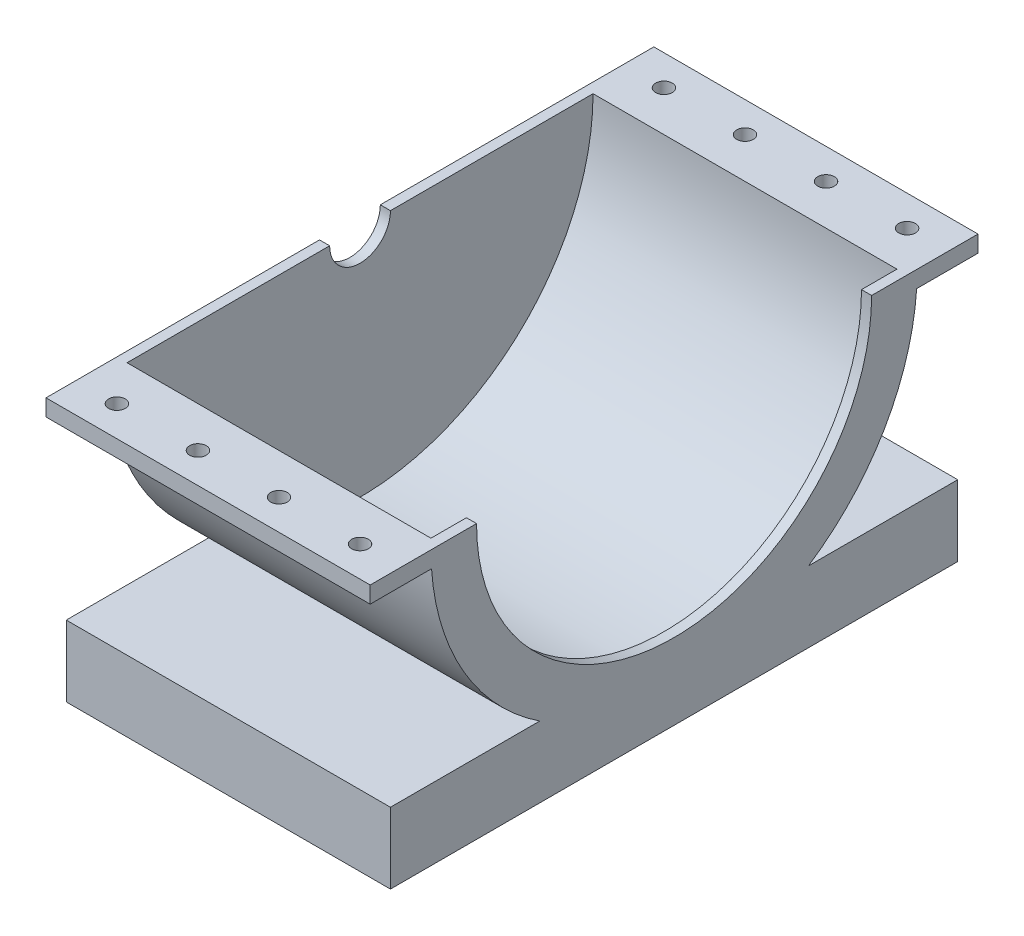
ISO-10303-21;
HEADER;
FILE_DESCRIPTION(('STEP AP214'),'2;1');
FILE_NAME('part.step','',(''),(''),'','','');
FILE_SCHEMA(('AUTOMOTIVE_DESIGN { 1 0 10303 214 1 1 1 1 }'));
ENDSEC;
DATA;
#1=APPLICATION_CONTEXT('core data for automotive mechanical design processes');
#2=APPLICATION_PROTOCOL_DEFINITION('international standard','automotive_design',2000,#1);
#3=PRODUCT_CONTEXT('',#1,'mechanical');
#4=PRODUCT('Part','Part','',(#3));
#5=PRODUCT_RELATED_PRODUCT_CATEGORY('part','',(#4));
#6=PRODUCT_DEFINITION_FORMATION('','',#4);
#7=PRODUCT_DEFINITION_CONTEXT('part definition',#1,'design');
#8=PRODUCT_DEFINITION('design','',#6,#7);
#9=PRODUCT_DEFINITION_SHAPE('','',#8);
#10=(LENGTH_UNIT() NAMED_UNIT(*) SI_UNIT(.MILLI.,.METRE.));
#11=(NAMED_UNIT(*) PLANE_ANGLE_UNIT() SI_UNIT($,.RADIAN.));
#12=(NAMED_UNIT(*) SI_UNIT($,.STERADIAN.) SOLID_ANGLE_UNIT());
#13=UNCERTAINTY_MEASURE_WITH_UNIT(LENGTH_MEASURE(1.E-05),#10,'distance_accuracy_value','');
#14=(GEOMETRIC_REPRESENTATION_CONTEXT(3) GLOBAL_UNCERTAINTY_ASSIGNED_CONTEXT((#13)) GLOBAL_UNIT_ASSIGNED_CONTEXT((#10,
#11,#12)) REPRESENTATION_CONTEXT('',''));
#15=CARTESIAN_POINT('',(0.,0.,0.));
#16=DIRECTION('',(0.,0.,1.));
#17=DIRECTION('',(1.,0.,0.));
#18=AXIS2_PLACEMENT_3D('',#15,#16,#17);
#19=CARTESIAN_POINT('',(105.467633956977,130.851537973943,190.5));
#20=DIRECTION('',(0.,1.,0.));
#21=DIRECTION('',(0.,0.,1.));
#22=AXIS2_PLACEMENT_3D('',#19,#20,#21);
#23=PLANE('',#22);
#24=DIRECTION('',(1.,0.,0.));
#25=VECTOR('',#24,1.);
#26=CARTESIAN_POINT('',(-97.757766043023,130.851537973943,123.825));
#27=LINE('',#26,#25);
#28=CARTESIAN_POINT('',(105.467633956977,130.851537973943,123.825));
#29=VERTEX_POINT('',#28);
#30=CARTESIAN_POINT('',(99.117633956977,130.851537973943,123.825));
#31=VERTEX_POINT('',#30);
#32=EDGE_CURVE('E200',#29,#31,#27,.F.);
#33=ORIENTED_EDGE('',*,*,#32,.T.);
#34=DIRECTION('',(0.,0.,-1.));
#35=VECTOR('',#34,1.);
#36=CARTESIAN_POINT('',(99.117633956977,130.851537973943,190.5));
#37=LINE('',#36,#35);
#38=CARTESIAN_POINT('',(99.117633956977,130.851537973943,146.05));
#39=VERTEX_POINT('',#38);
#40=EDGE_CURVE('E211',#39,#31,#37,.T.);
#41=ORIENTED_EDGE('',*,*,#40,.F.);
#42=DIRECTION('',(1.,0.,0.));
#43=VECTOR('',#42,1.);
#44=CARTESIAN_POINT('',(-91.3823660430229,130.851537973943,146.05));
#45=LINE('',#44,#43);
#46=CARTESIAN_POINT('',(-91.3823660430229,130.851537973943,146.05));
#47=VERTEX_POINT('',#46);
#48=EDGE_CURVE('E224',#47,#39,#45,.T.);
#49=ORIENTED_EDGE('',*,*,#48,.F.);
#50=DIRECTION('',(0.,0.,-1.));
#51=VECTOR('',#50,1.);
#52=CARTESIAN_POINT('',(-91.3823660430229,130.851537973943,190.5));
#53=LINE('',#52,#51);
#54=CARTESIAN_POINT('',(-91.3823660430229,130.851537973943,19.0500000000001));
#55=VERTEX_POINT('',#54);
#56=EDGE_CURVE('E12',#47,#55,#53,.T.);
#57=ORIENTED_EDGE('',*,*,#56,.T.);
#58=DIRECTION('',(1.,0.,0.));
#59=VECTOR('',#58,1.);
#60=CARTESIAN_POINT('',(-97.7323660430229,130.851537973943,19.0500000000001));
#61=LINE('',#60,#59);
#62=CARTESIAN_POINT('',(-97.7323660430229,130.851537973943,19.0500000000001));
#63=VERTEX_POINT('',#62);
#64=EDGE_CURVE('E98',#63,#55,#61,.T.);
#65=ORIENTED_EDGE('',*,*,#64,.F.);
#66=DIRECTION('',(0.,0.,-1.));
#67=VECTOR('',#66,1.);
#68=CARTESIAN_POINT('',(-97.7323660430229,130.851537973943,190.5));
#69=LINE('',#68,#67);
#70=CARTESIAN_POINT('',(-97.7323660430229,130.851537973943,190.5));
#71=VERTEX_POINT('',#70);
#72=EDGE_CURVE('E306',#71,#63,#69,.T.);
#73=ORIENTED_EDGE('',*,*,#72,.F.);
#74=DIRECTION('',(-1.,0.,0.));
#75=VECTOR('',#74,1.);
#76=CARTESIAN_POINT('',(105.467633956977,130.851537973943,190.5));
#77=LINE('',#76,#75);
#78=CARTESIAN_POINT('',(105.467633956977,130.851537973943,190.5));
#79=VERTEX_POINT('',#78);
#80=EDGE_CURVE('E314',#79,#71,#77,.T.);
#81=ORIENTED_EDGE('',*,*,#80,.F.);
#82=DIRECTION('',(0.,0.,-1.));
#83=VECTOR('',#82,1.);
#84=CARTESIAN_POINT('',(105.467633956977,130.851537973943,190.5));
#85=LINE('',#84,#83);
#86=EDGE_CURVE('E213',#79,#29,#85,.T.);
#87=ORIENTED_EDGE('',*,*,#86,.T.);
#88=EDGE_LOOP('',(#33,#41,#49,#57,#65,#73,#81,#87));
#89=FACE_BOUND('',#88,.T.);
#90=CARTESIAN_POINT('',(-72.332366043023,130.851537973943,171.45));
#91=DIRECTION('',(0.,1.,0.));
#92=DIRECTION('',(0.,0.,1.));
#93=AXIS2_PLACEMENT_3D('',#90,#91,#92);
#94=CIRCLE('',#93,5.20699999999999);
#95=CARTESIAN_POINT('',(-72.332366043023,130.851537973943,176.657));
#96=VERTEX_POINT('',#95);
#97=EDGE_CURVE('E370',#96,#96,#94,.T.);
#98=ORIENTED_EDGE('',*,*,#97,.F.);
#99=EDGE_LOOP('',(#98));
#100=FACE_BOUND('',#99,.T.);
#101=CARTESIAN_POINT('',(-21.532366043023,130.851537973943,171.45));
#102=DIRECTION('',(0.,1.,0.));
#103=DIRECTION('',(0.,0.,1.));
#104=AXIS2_PLACEMENT_3D('',#101,#102,#103);
#105=CIRCLE('',#104,5.20699999999999);
#106=CARTESIAN_POINT('',(-21.532366043023,130.851537973943,176.657));
#107=VERTEX_POINT('',#106);
#108=EDGE_CURVE('E364',#107,#107,#105,.T.);
#109=ORIENTED_EDGE('',*,*,#108,.F.);
#110=EDGE_LOOP('',(#109));
#111=FACE_BOUND('',#110,.T.);
#112=CARTESIAN_POINT('',(29.267633956977,130.851537973943,171.45));
#113=DIRECTION('',(0.,1.,0.));
#114=DIRECTION('',(0.,0.,1.));
#115=AXIS2_PLACEMENT_3D('',#112,#113,#114);
#116=CIRCLE('',#115,5.20699999999999);
#117=CARTESIAN_POINT('',(29.267633956977,130.851537973943,176.657));
#118=VERTEX_POINT('',#117);
#119=EDGE_CURVE('E358',#118,#118,#116,.T.);
#120=ORIENTED_EDGE('',*,*,#119,.F.);
#121=EDGE_LOOP('',(#120));
#122=FACE_BOUND('',#121,.T.);
#123=CARTESIAN_POINT('',(80.067633956977,130.851537973943,171.45));
#124=DIRECTION('',(0.,1.,0.));
#125=DIRECTION('',(0.,0.,1.));
#126=AXIS2_PLACEMENT_3D('',#123,#124,#125);
#127=CIRCLE('',#126,5.20699999999999);
#128=CARTESIAN_POINT('',(80.067633956977,130.851537973943,176.657));
#129=VERTEX_POINT('',#128);
#130=EDGE_CURVE('E352',#129,#129,#127,.T.);
#131=ORIENTED_EDGE('',*,*,#130,.F.);
#132=EDGE_LOOP('',(#131));
#133=FACE_BOUND('',#132,.T.);
#134=ADVANCED_FACE('F75',(#89,#100,#111,#122,#133),#23,.T.);
#135=DIRECTION('',(1.,0.,0.));
#136=VECTOR('',#135,1.);
#137=CARTESIAN_POINT('',(-97.757766043023,130.851537973943,-123.825));
#138=LINE('',#137,#136);
#139=CARTESIAN_POINT('',(99.117633956977,130.851537973943,-123.825));
#140=VERTEX_POINT('',#139);
#141=CARTESIAN_POINT('',(105.467633956977,130.851537973943,-123.825));
#142=VERTEX_POINT('',#141);
#143=EDGE_CURVE('E90',#140,#142,#138,.T.);
#144=ORIENTED_EDGE('',*,*,#143,.T.);
#145=CARTESIAN_POINT('',(105.467633956977,130.851537973943,-190.5));
#146=VERTEX_POINT('',#145);
#147=EDGE_CURVE('E313',#142,#146,#85,.T.);
#148=ORIENTED_EDGE('',*,*,#147,.T.);
#149=DIRECTION('',(-1.,0.,0.));
#150=VECTOR('',#149,1.);
#151=CARTESIAN_POINT('',(105.467633956977,130.851537973943,-190.5));
#152=LINE('',#151,#150);
#153=CARTESIAN_POINT('',(-97.7323660430229,130.851537973943,-190.5));
#154=VERTEX_POINT('',#153);
#155=EDGE_CURVE('E326',#146,#154,#152,.T.);
#156=ORIENTED_EDGE('',*,*,#155,.T.);
#157=CARTESIAN_POINT('',(-97.7323660430229,130.851537973943,-19.0499999999999));
#158=VERTEX_POINT('',#157);
#159=EDGE_CURVE('E322',#158,#154,#69,.T.);
#160=ORIENTED_EDGE('',*,*,#159,.F.);
#161=DIRECTION('',(1.,0.,0.));
#162=VECTOR('',#161,1.);
#163=CARTESIAN_POINT('',(-97.7323660430229,130.851537973943,-19.0499999999999));
#164=LINE('',#163,#162);
#165=CARTESIAN_POINT('',(-91.3823660430229,130.851537973943,-19.0499999999999));
#166=VERTEX_POINT('',#165);
#167=EDGE_CURVE('E239',#158,#166,#164,.T.);
#168=ORIENTED_EDGE('',*,*,#167,.T.);
#169=CARTESIAN_POINT('',(-91.3823660430229,130.851537973943,-146.05));
#170=VERTEX_POINT('',#169);
#171=EDGE_CURVE('E83',#166,#170,#53,.T.);
#172=ORIENTED_EDGE('',*,*,#171,.T.);
#173=DIRECTION('',(1.,0.,0.));
#174=VECTOR('',#173,1.);
#175=CARTESIAN_POINT('',(-91.3823660430229,130.851537973943,-146.05));
#176=LINE('',#175,#174);
#177=CARTESIAN_POINT('',(99.117633956977,130.851537973943,-146.05));
#178=VERTEX_POINT('',#177);
#179=EDGE_CURVE('E220',#178,#170,#176,.F.);
#180=ORIENTED_EDGE('',*,*,#179,.F.);
#181=EDGE_CURVE('E221',#140,#178,#37,.T.);
#182=ORIENTED_EDGE('',*,*,#181,.F.);
#183=EDGE_LOOP('',(#144,#148,#156,#160,#168,#172,#180,#182));
#184=FACE_BOUND('',#183,.T.);
#185=CARTESIAN_POINT('',(80.067633956977,130.851537973943,-171.45));
#186=DIRECTION('',(0.,1.,0.));
#187=DIRECTION('',(0.,0.,1.));
#188=AXIS2_PLACEMENT_3D('',#185,#186,#187);
#189=CIRCLE('',#188,5.20699999999999);
#190=CARTESIAN_POINT('',(80.067633956977,130.851537973943,-166.243));
#191=VERTEX_POINT('',#190);
#192=EDGE_CURVE('E376',#191,#191,#189,.T.);
#193=ORIENTED_EDGE('',*,*,#192,.F.);
#194=EDGE_LOOP('',(#193));
#195=FACE_BOUND('',#194,.T.);
#196=CARTESIAN_POINT('',(29.267633956977,130.851537973943,-171.45));
#197=DIRECTION('',(0.,1.,0.));
#198=DIRECTION('',(0.,0.,1.));
#199=AXIS2_PLACEMENT_3D('',#196,#197,#198);
#200=CIRCLE('',#199,5.20699999999999);
#201=CARTESIAN_POINT('',(29.267633956977,130.851537973943,-166.243));
#202=VERTEX_POINT('',#201);
#203=EDGE_CURVE('E382',#202,#202,#200,.T.);
#204=ORIENTED_EDGE('',*,*,#203,.F.);
#205=EDGE_LOOP('',(#204));
#206=FACE_BOUND('',#205,.T.);
#207=CARTESIAN_POINT('',(-21.532366043023,130.851537973943,-171.45));
#208=DIRECTION('',(0.,1.,0.));
#209=DIRECTION('',(0.,0.,1.));
#210=AXIS2_PLACEMENT_3D('',#207,#208,#209);
#211=CIRCLE('',#210,5.20699999999999);
#212=CARTESIAN_POINT('',(-21.532366043023,130.851537973943,-166.243));
#213=VERTEX_POINT('',#212);
#214=EDGE_CURVE('E388',#213,#213,#211,.T.);
#215=ORIENTED_EDGE('',*,*,#214,.F.);
#216=EDGE_LOOP('',(#215));
#217=FACE_BOUND('',#216,.T.);
#218=CARTESIAN_POINT('',(-72.332366043023,130.851537973943,-171.45));
#219=DIRECTION('',(0.,1.,0.));
#220=DIRECTION('',(0.,0.,1.));
#221=AXIS2_PLACEMENT_3D('',#218,#219,#220);
#222=CIRCLE('',#221,5.20699999999999);
#223=CARTESIAN_POINT('',(-72.332366043023,130.851537973943,-166.243));
#224=VERTEX_POINT('',#223);
#225=EDGE_CURVE('E250',#224,#224,#222,.T.);
#226=ORIENTED_EDGE('',*,*,#225,.F.);
#227=EDGE_LOOP('',(#226));
#228=FACE_BOUND('',#227,.T.);
#229=ADVANCED_FACE('F236',(#184,#195,#206,#217,#228),#23,.T.);
#230=CARTESIAN_POINT('',(105.467633956977,3.85153797394263,0.));
#231=DIRECTION('',(0.,1.,0.));
#232=DIRECTION('',(0.,0.,1.));
#233=AXIS2_PLACEMENT_3D('',#230,#231,#232);
#234=PLANE('',#233);
#235=DIRECTION('',(0.,0.,-1.));
#236=VECTOR('',#235,1.);
#237=CARTESIAN_POINT('',(-97.7323660430229,3.85153797394263,0.));
#238=LINE('',#237,#236);
#239=CARTESIAN_POINT('',(-97.7323660430229,3.85153797394263,-84.2422696750271));
#240=VERTEX_POINT('',#239);
#241=CARTESIAN_POINT('',(-97.7323660430229,3.85153797394263,-177.8));
#242=VERTEX_POINT('',#241);
#243=EDGE_CURVE('E272',#240,#242,#238,.T.);
#244=ORIENTED_EDGE('',*,*,#243,.F.);
#245=DIRECTION('',(-1.,0.,0.));
#246=VECTOR('',#245,1.);
#247=CARTESIAN_POINT('',(105.467633956977,3.85153797394263,-84.2422696750271));
#248=LINE('',#247,#246);
#249=CARTESIAN_POINT('',(105.467633956977,3.85153797394263,-84.2422696750271));
#250=VERTEX_POINT('',#249);
#251=EDGE_CURVE('E226',#250,#240,#248,.T.);
#252=ORIENTED_EDGE('',*,*,#251,.F.);
#253=DIRECTION('',(0.,0.,-1.));
#254=VECTOR('',#253,1.);
#255=CARTESIAN_POINT('',(105.467633956977,3.85153797394263,0.));
#256=LINE('',#255,#254);
#257=CARTESIAN_POINT('',(105.467633956977,3.85153797394263,-177.8));
#258=VERTEX_POINT('',#257);
#259=EDGE_CURVE('E255',#250,#258,#256,.T.);
#260=ORIENTED_EDGE('',*,*,#259,.T.);
#261=DIRECTION('',(-1.,0.,0.));
#262=VECTOR('',#261,1.);
#263=CARTESIAN_POINT('',(105.467633956977,3.85153797394263,-177.8));
#264=LINE('',#263,#262);
#265=EDGE_CURVE('E271',#258,#242,#264,.T.);
#266=ORIENTED_EDGE('',*,*,#265,.T.);
#267=EDGE_LOOP('',(#244,#252,#260,#266));
#268=FACE_BOUND('',#267,.T.);
#269=ADVANCED_FACE('F403',(#268),#234,.T.);
#270=CARTESIAN_POINT('',(105.467633956977,130.851537973943,0.));
#271=DIRECTION('',(-1.,0.,0.));
#272=DIRECTION('',(0.,0.,1.));
#273=AXIS2_PLACEMENT_3D('',#270,#271,#272);
#274=CYLINDRICAL_SURFACE('',#273,152.4);
#275=CARTESIAN_POINT('',(-97.7323660430229,130.851537973943,0.));
#276=DIRECTION('',(1.,0.,0.));
#277=DIRECTION('',(0.,0.,-1.));
#278=AXIS2_PLACEMENT_3D('',#275,#276,#277);
#279=CIRCLE('',#278,152.4);
#280=CARTESIAN_POINT('',(-97.7323660430229,120.437537973943,-152.043772000039));
#281=VERTEX_POINT('',#280);
#282=EDGE_CURVE('E275',#281,#240,#279,.F.);
#283=ORIENTED_EDGE('',*,*,#282,.F.);
#284=DIRECTION('',(-1.,0.,0.));
#285=VECTOR('',#284,1.);
#286=CARTESIAN_POINT('',(105.467633956977,120.437537973943,-152.043772000039));
#287=LINE('',#286,#285);
#288=CARTESIAN_POINT('',(105.467633956977,120.437537973943,-152.043772000039));
#289=VERTEX_POINT('',#288);
#290=EDGE_CURVE('E299',#289,#281,#287,.T.);
#291=ORIENTED_EDGE('',*,*,#290,.F.);
#292=CARTESIAN_POINT('',(105.467633956977,130.851537973943,0.));
#293=DIRECTION('',(1.,0.,0.));
#294=DIRECTION('',(0.,0.,-1.));
#295=AXIS2_PLACEMENT_3D('',#292,#293,#294);
#296=CIRCLE('',#295,152.4);
#297=EDGE_CURVE('E258',#289,#250,#296,.F.);
#298=ORIENTED_EDGE('',*,*,#297,.T.);
#299=ORIENTED_EDGE('',*,*,#251,.T.);
#300=EDGE_LOOP('',(#283,#291,#298,#299));
#301=FACE_BOUND('',#300,.T.);
#302=ADVANCED_FACE('F410',(#301),#274,.T.);
#303=CARTESIAN_POINT('',(-97.7323660430229,3.85153797394263,84.2422696750272));
#304=VERTEX_POINT('',#303);
#305=CARTESIAN_POINT('',(-97.7323660430229,120.437537973943,152.04377200004));
#306=VERTEX_POINT('',#305);
#307=EDGE_CURVE('E279',#304,#306,#279,.F.);
#308=ORIENTED_EDGE('',*,*,#307,.F.);
#309=DIRECTION('',(-1.,0.,0.));
#310=VECTOR('',#309,1.);
#311=CARTESIAN_POINT('',(105.467633956977,3.85153797394263,84.2422696750272));
#312=LINE('',#311,#310);
#313=CARTESIAN_POINT('',(105.467633956977,3.85153797394263,84.2422696750272));
#314=VERTEX_POINT('',#313);
#315=EDGE_CURVE('E295',#314,#304,#312,.T.);
#316=ORIENTED_EDGE('',*,*,#315,.F.);
#317=CARTESIAN_POINT('',(105.467633956977,120.437537973943,152.04377200004));
#318=VERTEX_POINT('',#317);
#319=EDGE_CURVE('E263',#314,#318,#296,.F.);
#320=ORIENTED_EDGE('',*,*,#319,.T.);
#321=DIRECTION('',(-1.,0.,0.));
#322=VECTOR('',#321,1.);
#323=CARTESIAN_POINT('',(105.467633956977,120.437537973943,152.04377200004));
#324=LINE('',#323,#322);
#325=EDGE_CURVE('E297',#318,#306,#324,.T.);
#326=ORIENTED_EDGE('',*,*,#325,.T.);
#327=EDGE_LOOP('',(#308,#316,#320,#326));
#328=FACE_BOUND('',#327,.T.);
#329=ADVANCED_FACE('F611',(#328),#274,.T.);
#330=CARTESIAN_POINT('',(-97.7323660430229,3.85153797394263,177.8));
#331=VERTEX_POINT('',#330);
#332=EDGE_CURVE('E276',#331,#304,#238,.T.);
#333=ORIENTED_EDGE('',*,*,#332,.F.);
#334=DIRECTION('',(-1.,0.,0.));
#335=VECTOR('',#334,1.);
#336=CARTESIAN_POINT('',(105.467633956977,3.85153797394263,177.8));
#337=LINE('',#336,#335);
#338=CARTESIAN_POINT('',(105.467633956977,3.85153797394263,177.8));
#339=VERTEX_POINT('',#338);
#340=EDGE_CURVE('E293',#339,#331,#337,.T.);
#341=ORIENTED_EDGE('',*,*,#340,.F.);
#342=EDGE_CURVE('E260',#339,#314,#256,.T.);
#343=ORIENTED_EDGE('',*,*,#342,.T.);
#344=ORIENTED_EDGE('',*,*,#315,.T.);
#345=EDGE_LOOP('',(#333,#341,#343,#344));
#346=FACE_BOUND('',#345,.T.);
#347=ADVANCED_FACE('F413',(#346),#234,.T.);
#348=CARTESIAN_POINT('',(105.467633956977,-18.3734620260574,177.8));
#349=DIRECTION('',(0.,0.,1.));
#350=DIRECTION('',(1.,0.,0.));
#351=AXIS2_PLACEMENT_3D('',#348,#349,#350);
#352=PLANE('',#351);
#353=DIRECTION('',(0.,1.,0.));
#354=VECTOR('',#353,1.);
#355=CARTESIAN_POINT('',(-97.7323660430229,-18.3734620260574,177.8));
#356=LINE('',#355,#354);
#357=CARTESIAN_POINT('',(-97.7323660430229,-40.5984620260574,177.8));
#358=VERTEX_POINT('',#357);
#359=EDGE_CURVE('E280',#358,#331,#356,.T.);
#360=ORIENTED_EDGE('',*,*,#359,.F.);
#361=DIRECTION('',(-1.,0.,0.));
#362=VECTOR('',#361,1.);
#363=CARTESIAN_POINT('',(105.467633956977,-40.5984620260574,177.8));
#364=LINE('',#363,#362);
#365=CARTESIAN_POINT('',(105.467633956977,-40.5984620260574,177.8));
#366=VERTEX_POINT('',#365);
#367=EDGE_CURVE('E291',#366,#358,#364,.T.);
#368=ORIENTED_EDGE('',*,*,#367,.F.);
#369=DIRECTION('',(0.,1.,0.));
#370=VECTOR('',#369,1.);
#371=CARTESIAN_POINT('',(105.467633956977,-18.3734620260574,177.8));
#372=LINE('',#371,#370);
#373=EDGE_CURVE('E264',#366,#339,#372,.T.);
#374=ORIENTED_EDGE('',*,*,#373,.T.);
#375=ORIENTED_EDGE('',*,*,#340,.T.);
#376=EDGE_LOOP('',(#360,#368,#374,#375));
#377=FACE_BOUND('',#376,.T.);
#378=ADVANCED_FACE('F590',(#377),#352,.T.);
#379=CARTESIAN_POINT('',(105.467633956977,-40.5984620260574,0.));
#380=DIRECTION('',(0.,1.,0.));
#381=DIRECTION('',(0.,0.,1.));
#382=AXIS2_PLACEMENT_3D('',#379,#380,#381);
#383=PLANE('',#382);
#384=DIRECTION('',(0.,0.,-1.));
#385=VECTOR('',#384,1.);
#386=CARTESIAN_POINT('',(-97.7323660430229,-40.5984620260574,0.));
#387=LINE('',#386,#385);
#388=CARTESIAN_POINT('',(-97.7323660430229,-40.5984620260574,-177.8));
#389=VERTEX_POINT('',#388);
#390=EDGE_CURVE('E283',#358,#389,#387,.T.);
#391=ORIENTED_EDGE('',*,*,#390,.T.);
#392=DIRECTION('',(-1.,0.,0.));
#393=VECTOR('',#392,1.);
#394=CARTESIAN_POINT('',(105.467633956977,-40.5984620260574,-177.8));
#395=LINE('',#394,#393);
#396=CARTESIAN_POINT('',(105.467633956977,-40.5984620260574,-177.8));
#397=VERTEX_POINT('',#396);
#398=EDGE_CURVE('E288',#397,#389,#395,.T.);
#399=ORIENTED_EDGE('',*,*,#398,.F.);
#400=DIRECTION('',(0.,0.,-1.));
#401=VECTOR('',#400,1.);
#402=CARTESIAN_POINT('',(105.467633956977,-40.5984620260574,0.));
#403=LINE('',#402,#401);
#404=EDGE_CURVE('E267',#366,#397,#403,.T.);
#405=ORIENTED_EDGE('',*,*,#404,.F.);
#406=ORIENTED_EDGE('',*,*,#367,.T.);
#407=EDGE_LOOP('',(#391,#399,#405,#406));
#408=FACE_BOUND('',#407,.T.);
#409=ADVANCED_FACE('F580',(#408),#383,.F.);
#410=CARTESIAN_POINT('',(105.467633956977,-18.3734620260574,-177.8));
#411=DIRECTION('',(0.,0.,1.));
#412=DIRECTION('',(1.,0.,0.));
#413=AXIS2_PLACEMENT_3D('',#410,#411,#412);
#414=PLANE('',#413);
#415=DIRECTION('',(0.,1.,0.));
#416=VECTOR('',#415,1.);
#417=CARTESIAN_POINT('',(-97.7323660430229,-18.3734620260574,-177.8));
#418=LINE('',#417,#416);
#419=EDGE_CURVE('E259',#389,#242,#418,.T.);
#420=ORIENTED_EDGE('',*,*,#419,.T.);
#421=ORIENTED_EDGE('',*,*,#265,.F.);
#422=DIRECTION('',(0.,1.,0.));
#423=VECTOR('',#422,1.);
#424=CARTESIAN_POINT('',(105.467633956977,-18.3734620260574,-177.8));
#425=LINE('',#424,#423);
#426=EDGE_CURVE('E269',#397,#258,#425,.T.);
#427=ORIENTED_EDGE('',*,*,#426,.F.);
#428=ORIENTED_EDGE('',*,*,#398,.T.);
#429=EDGE_LOOP('',(#420,#421,#427,#428));
#430=FACE_BOUND('',#429,.T.);
#431=ADVANCED_FACE('F435',(#430),#414,.F.);
#432=CARTESIAN_POINT('',(105.467633956977,-18.3734620260574,0.));
#433=DIRECTION('',(1.,0.,0.));
#434=DIRECTION('',(0.,0.,-1.));
#435=AXIS2_PLACEMENT_3D('',#432,#433,#434);
#436=PLANE('',#435);
#437=CARTESIAN_POINT('',(105.467633956977,130.851537973943,0.));
#438=DIRECTION('',(1.,0.,0.));
#439=DIRECTION('',(0.,0.,-1.));
#440=AXIS2_PLACEMENT_3D('',#437,#438,#439);
#441=CIRCLE('',#440,123.825);
#442=EDGE_CURVE('E214',#29,#142,#441,.T.);
#443=ORIENTED_EDGE('',*,*,#442,.F.);
#444=ORIENTED_EDGE('',*,*,#86,.F.);
#445=DIRECTION('',(0.,-1.,0.));
#446=VECTOR('',#445,1.);
#447=CARTESIAN_POINT('',(105.467633956977,130.851537973943,190.5));
#448=LINE('',#447,#446);
#449=CARTESIAN_POINT('',(105.467633956977,120.437537973943,190.5));
#450=VERTEX_POINT('',#449);
#451=EDGE_CURVE('E302',#79,#450,#448,.T.);
#452=ORIENTED_EDGE('',*,*,#451,.T.);
#453=DIRECTION('',(0.,0.,-1.));
#454=VECTOR('',#453,1.);
#455=CARTESIAN_POINT('',(105.467633956977,120.437537973943,190.5));
#456=LINE('',#455,#454);
#457=EDGE_CURVE('E307',#450,#318,#456,.T.);
#458=ORIENTED_EDGE('',*,*,#457,.T.);
#459=ORIENTED_EDGE('',*,*,#319,.F.);
#460=ORIENTED_EDGE('',*,*,#342,.F.);
#461=ORIENTED_EDGE('',*,*,#373,.F.);
#462=ORIENTED_EDGE('',*,*,#404,.T.);
#463=ORIENTED_EDGE('',*,*,#426,.T.);
#464=ORIENTED_EDGE('',*,*,#259,.F.);
#465=ORIENTED_EDGE('',*,*,#297,.F.);
#466=CARTESIAN_POINT('',(105.467633956977,120.437537973943,-190.5));
#467=VERTEX_POINT('',#466);
#468=EDGE_CURVE('E305',#289,#467,#456,.T.);
#469=ORIENTED_EDGE('',*,*,#468,.T.);
#470=DIRECTION('',(0.,-1.,0.));
#471=VECTOR('',#470,1.);
#472=CARTESIAN_POINT('',(105.467633956977,130.851537973943,-190.5));
#473=LINE('',#472,#471);
#474=EDGE_CURVE('E310',#146,#467,#473,.T.);
#475=ORIENTED_EDGE('',*,*,#474,.F.);
#476=ORIENTED_EDGE('',*,*,#147,.F.);
#477=EDGE_LOOP('',(#443,#444,#452,#458,#459,#460,#461,#462,#463,#464,#465,#469,#475,#476));
#478=FACE_BOUND('',#477,.T.);
#479=ADVANCED_FACE('F430',(#478),#436,.T.);
#480=CARTESIAN_POINT('',(-97.7323660430229,-18.3734620260574,0.));
#481=DIRECTION('',(1.,0.,0.));
#482=DIRECTION('',(0.,0.,-1.));
#483=AXIS2_PLACEMENT_3D('',#480,#481,#482);
#484=PLANE('',#483);
#485=ORIENTED_EDGE('',*,*,#72,.T.);
#486=CARTESIAN_POINT('',(-97.7323660430229,130.851537973943,0.));
#487=DIRECTION('',(1.,0.,0.));
#488=DIRECTION('',(0.,0.,-1.));
#489=AXIS2_PLACEMENT_3D('',#486,#487,#488);
#490=CIRCLE('',#489,19.05);
#491=EDGE_CURVE('E345',#63,#158,#490,.T.);
#492=ORIENTED_EDGE('',*,*,#491,.T.);
#493=ORIENTED_EDGE('',*,*,#159,.T.);
#494=DIRECTION('',(0.,-1.,0.));
#495=VECTOR('',#494,1.);
#496=CARTESIAN_POINT('',(-97.7323660430229,130.851537973943,-190.5));
#497=LINE('',#496,#495);
#498=CARTESIAN_POINT('',(-97.7323660430229,120.437537973943,-190.5));
#499=VERTEX_POINT('',#498);
#500=EDGE_CURVE('E319',#154,#499,#497,.T.);
#501=ORIENTED_EDGE('',*,*,#500,.T.);
#502=DIRECTION('',(0.,0.,-1.));
#503=VECTOR('',#502,1.);
#504=CARTESIAN_POINT('',(-97.7323660430229,120.437537973943,190.5));
#505=LINE('',#504,#503);
#506=EDGE_CURVE('E248',#281,#499,#505,.T.);
#507=ORIENTED_EDGE('',*,*,#506,.F.);
#508=ORIENTED_EDGE('',*,*,#282,.T.);
#509=ORIENTED_EDGE('',*,*,#243,.T.);
#510=ORIENTED_EDGE('',*,*,#419,.F.);
#511=ORIENTED_EDGE('',*,*,#390,.F.);
#512=ORIENTED_EDGE('',*,*,#359,.T.);
#513=ORIENTED_EDGE('',*,*,#332,.T.);
#514=ORIENTED_EDGE('',*,*,#307,.T.);
#515=CARTESIAN_POINT('',(-97.7323660430229,120.437537973943,190.5));
#516=VERTEX_POINT('',#515);
#517=EDGE_CURVE('E316',#516,#306,#505,.T.);
#518=ORIENTED_EDGE('',*,*,#517,.F.);
#519=DIRECTION('',(0.,-1.,0.));
#520=VECTOR('',#519,1.);
#521=CARTESIAN_POINT('',(-97.7323660430229,130.851537973943,190.5));
#522=LINE('',#521,#520);
#523=EDGE_CURVE('E245',#71,#516,#522,.T.);
#524=ORIENTED_EDGE('',*,*,#523,.F.);
#525=EDGE_LOOP('',(#485,#492,#493,#501,#507,#508,#509,#510,#511,#512,#513,#514,#518,#524));
#526=FACE_BOUND('',#525,.T.);
#527=ADVANCED_FACE('F343',(#526),#484,.F.);
#528=CARTESIAN_POINT('',(105.467633956977,130.851537973943,190.5));
#529=DIRECTION('',(0.,0.,-1.));
#530=DIRECTION('',(0.,1.,0.));
#531=AXIS2_PLACEMENT_3D('',#528,#529,#530);
#532=PLANE('',#531);
#533=ORIENTED_EDGE('',*,*,#523,.T.);
#534=DIRECTION('',(-1.,0.,0.));
#535=VECTOR('',#534,1.);
#536=CARTESIAN_POINT('',(105.467633956977,120.437537973943,190.5));
#537=LINE('',#536,#535);
#538=EDGE_CURVE('E228',#450,#516,#537,.T.);
#539=ORIENTED_EDGE('',*,*,#538,.F.);
#540=ORIENTED_EDGE('',*,*,#451,.F.);
#541=ORIENTED_EDGE('',*,*,#80,.T.);
#542=EDGE_LOOP('',(#533,#539,#540,#541));
#543=FACE_BOUND('',#542,.T.);
#544=ADVANCED_FACE('F77',(#543),#532,.F.);
#545=CARTESIAN_POINT('',(105.467633956977,130.851537973943,-190.5));
#546=DIRECTION('',(0.,0.,-1.));
#547=DIRECTION('',(0.,1.,0.));
#548=AXIS2_PLACEMENT_3D('',#545,#546,#547);
#549=PLANE('',#548);
#550=ORIENTED_EDGE('',*,*,#500,.F.);
#551=ORIENTED_EDGE('',*,*,#155,.F.);
#552=ORIENTED_EDGE('',*,*,#474,.T.);
#553=DIRECTION('',(-1.,0.,0.));
#554=VECTOR('',#553,1.);
#555=CARTESIAN_POINT('',(105.467633956977,120.437537973943,-190.5));
#556=LINE('',#555,#554);
#557=EDGE_CURVE('E328',#467,#499,#556,.T.);
#558=ORIENTED_EDGE('',*,*,#557,.T.);
#559=EDGE_LOOP('',(#550,#551,#552,#558));
#560=FACE_BOUND('',#559,.T.);
#561=ADVANCED_FACE('F414',(#560),#549,.T.);
#562=CARTESIAN_POINT('',(105.467633956977,120.437537973943,190.5));
#563=DIRECTION('',(0.,1.,0.));
#564=DIRECTION('',(0.,0.,1.));
#565=AXIS2_PLACEMENT_3D('',#562,#563,#564);
#566=PLANE('',#565);
#567=CARTESIAN_POINT('',(80.067633956977,120.437537973943,-171.45));
#568=DIRECTION('',(0.,1.,0.));
#569=DIRECTION('',(0.,0.,1.));
#570=AXIS2_PLACEMENT_3D('',#567,#568,#569);
#571=CIRCLE('',#570,5.20699999999999);
#572=CARTESIAN_POINT('',(80.067633956977,120.437537973943,-166.243));
#573=VERTEX_POINT('',#572);
#574=EDGE_CURVE('E379',#573,#573,#571,.F.);
#575=ORIENTED_EDGE('',*,*,#574,.F.);
#576=EDGE_LOOP('',(#575));
#577=FACE_BOUND('',#576,.T.);
#578=CARTESIAN_POINT('',(29.267633956977,120.437537973943,-171.45));
#579=DIRECTION('',(0.,1.,0.));
#580=DIRECTION('',(0.,0.,1.));
#581=AXIS2_PLACEMENT_3D('',#578,#579,#580);
#582=CIRCLE('',#581,5.20699999999999);
#583=CARTESIAN_POINT('',(29.267633956977,120.437537973943,-166.243));
#584=VERTEX_POINT('',#583);
#585=EDGE_CURVE('E385',#584,#584,#582,.F.);
#586=ORIENTED_EDGE('',*,*,#585,.F.);
#587=EDGE_LOOP('',(#586));
#588=FACE_BOUND('',#587,.T.);
#589=CARTESIAN_POINT('',(-21.532366043023,120.437537973943,-171.45));
#590=DIRECTION('',(0.,1.,0.));
#591=DIRECTION('',(0.,0.,1.));
#592=AXIS2_PLACEMENT_3D('',#589,#590,#591);
#593=CIRCLE('',#592,5.20699999999999);
#594=CARTESIAN_POINT('',(-21.532366043023,120.437537973943,-166.243));
#595=VERTEX_POINT('',#594);
#596=EDGE_CURVE('E391',#595,#595,#593,.F.);
#597=ORIENTED_EDGE('',*,*,#596,.F.);
#598=EDGE_LOOP('',(#597));
#599=FACE_BOUND('',#598,.T.);
#600=CARTESIAN_POINT('',(-72.332366043023,120.437537973943,-171.45));
#601=DIRECTION('',(0.,1.,0.));
#602=DIRECTION('',(0.,0.,1.));
#603=AXIS2_PLACEMENT_3D('',#600,#601,#602);
#604=CIRCLE('',#603,5.20699999999999);
#605=CARTESIAN_POINT('',(-72.332366043023,120.437537973943,-166.243));
#606=VERTEX_POINT('',#605);
#607=EDGE_CURVE('E393',#606,#606,#604,.F.);
#608=ORIENTED_EDGE('',*,*,#607,.F.);
#609=EDGE_LOOP('',(#608));
#610=FACE_BOUND('',#609,.T.);
#611=ORIENTED_EDGE('',*,*,#468,.F.);
#612=ORIENTED_EDGE('',*,*,#290,.T.);
#613=ORIENTED_EDGE('',*,*,#506,.T.);
#614=ORIENTED_EDGE('',*,*,#557,.F.);
#615=EDGE_LOOP('',(#611,#612,#613,#614));
#616=FACE_BOUND('',#615,.T.);
#617=ADVANCED_FACE('F405',(#577,#588,#599,#610,#616),#566,.F.);
#618=CARTESIAN_POINT('',(80.067633956977,120.437537973943,171.45));
#619=DIRECTION('',(0.,1.,0.));
#620=DIRECTION('',(0.,0.,1.));
#621=AXIS2_PLACEMENT_3D('',#618,#619,#620);
#622=CIRCLE('',#621,5.20699999999999);
#623=CARTESIAN_POINT('',(80.067633956977,120.437537973943,176.657));
#624=VERTEX_POINT('',#623);
#625=EDGE_CURVE('E355',#624,#624,#622,.F.);
#626=ORIENTED_EDGE('',*,*,#625,.F.);
#627=EDGE_LOOP('',(#626));
#628=FACE_BOUND('',#627,.T.);
#629=CARTESIAN_POINT('',(29.267633956977,120.437537973943,171.45));
#630=DIRECTION('',(0.,1.,0.));
#631=DIRECTION('',(0.,0.,1.));
#632=AXIS2_PLACEMENT_3D('',#629,#630,#631);
#633=CIRCLE('',#632,5.20699999999999);
#634=CARTESIAN_POINT('',(29.267633956977,120.437537973943,176.657));
#635=VERTEX_POINT('',#634);
#636=EDGE_CURVE('E361',#635,#635,#633,.F.);
#637=ORIENTED_EDGE('',*,*,#636,.F.);
#638=EDGE_LOOP('',(#637));
#639=FACE_BOUND('',#638,.T.);
#640=CARTESIAN_POINT('',(-21.532366043023,120.437537973943,171.45));
#641=DIRECTION('',(0.,1.,0.));
#642=DIRECTION('',(0.,0.,1.));
#643=AXIS2_PLACEMENT_3D('',#640,#641,#642);
#644=CIRCLE('',#643,5.20699999999999);
#645=CARTESIAN_POINT('',(-21.532366043023,120.437537973943,176.657));
#646=VERTEX_POINT('',#645);
#647=EDGE_CURVE('E367',#646,#646,#644,.F.);
#648=ORIENTED_EDGE('',*,*,#647,.F.);
#649=EDGE_LOOP('',(#648));
#650=FACE_BOUND('',#649,.T.);
#651=CARTESIAN_POINT('',(-72.332366043023,120.437537973943,171.45));
#652=DIRECTION('',(0.,1.,0.));
#653=DIRECTION('',(0.,0.,1.));
#654=AXIS2_PLACEMENT_3D('',#651,#652,#653);
#655=CIRCLE('',#654,5.20699999999999);
#656=CARTESIAN_POINT('',(-72.332366043023,120.437537973943,176.657));
#657=VERTEX_POINT('',#656);
#658=EDGE_CURVE('E373',#657,#657,#655,.F.);
#659=ORIENTED_EDGE('',*,*,#658,.F.);
#660=EDGE_LOOP('',(#659));
#661=FACE_BOUND('',#660,.T.);
#662=ORIENTED_EDGE('',*,*,#325,.F.);
#663=ORIENTED_EDGE('',*,*,#457,.F.);
#664=ORIENTED_EDGE('',*,*,#538,.T.);
#665=ORIENTED_EDGE('',*,*,#517,.T.);
#666=EDGE_LOOP('',(#662,#663,#664,#665));
#667=FACE_BOUND('',#666,.T.);
#668=ADVANCED_FACE('F336',(#628,#639,#650,#661,#667),#566,.F.);
#669=CARTESIAN_POINT('',(-91.3823660430229,130.851537973943,0.));
#670=DIRECTION('',(1.,0.,0.));
#671=DIRECTION('',(0.,0.,-1.));
#672=AXIS2_PLACEMENT_3D('',#669,#670,#671);
#673=CYLINDRICAL_SURFACE('',#672,146.05);
#674=ORIENTED_EDGE('',*,*,#48,.T.);
#675=CARTESIAN_POINT('',(99.117633956977,130.851537973943,0.));
#676=DIRECTION('',(1.,0.,0.));
#677=DIRECTION('',(0.,0.,-1.));
#678=AXIS2_PLACEMENT_3D('',#675,#676,#677);
#679=CIRCLE('',#678,146.05);
#680=EDGE_CURVE('E218',#39,#178,#679,.T.);
#681=ORIENTED_EDGE('',*,*,#680,.T.);
#682=ORIENTED_EDGE('',*,*,#179,.T.);
#683=CARTESIAN_POINT('',(-91.3823660430229,130.851537973943,0.));
#684=DIRECTION('',(1.,0.,0.));
#685=DIRECTION('',(0.,0.,-1.));
#686=AXIS2_PLACEMENT_3D('',#683,#684,#685);
#687=CIRCLE('',#686,146.05);
#688=EDGE_CURVE('E243',#47,#170,#687,.T.);
#689=ORIENTED_EDGE('',*,*,#688,.F.);
#690=EDGE_LOOP('',(#674,#681,#682,#689));
#691=FACE_BOUND('',#690,.T.);
#692=ADVANCED_FACE('F242',(#691),#673,.F.);
#693=CARTESIAN_POINT('',(-91.3823660430229,130.851537973943,0.));
#694=DIRECTION('',(1.,0.,0.));
#695=DIRECTION('',(0.,0.,-1.));
#696=AXIS2_PLACEMENT_3D('',#693,#694,#695);
#697=PLANE('',#696);
#698=CARTESIAN_POINT('',(-91.3823660430229,130.851537973943,0.));
#699=DIRECTION('',(1.,0.,0.));
#700=DIRECTION('',(0.,0.,-1.));
#701=AXIS2_PLACEMENT_3D('',#698,#699,#700);
#702=CIRCLE('',#701,19.05);
#703=EDGE_CURVE('E347',#55,#166,#702,.T.);
#704=ORIENTED_EDGE('',*,*,#703,.F.);
#705=ORIENTED_EDGE('',*,*,#56,.F.);
#706=ORIENTED_EDGE('',*,*,#688,.T.);
#707=ORIENTED_EDGE('',*,*,#171,.F.);
#708=EDGE_LOOP('',(#704,#705,#706,#707));
#709=FACE_BOUND('',#708,.T.);
#710=ADVANCED_FACE('F244',(#709),#697,.T.);
#711=CARTESIAN_POINT('',(99.117633956977,130.851537973943,0.));
#712=DIRECTION('',(1.,0.,0.));
#713=DIRECTION('',(0.,0.,-1.));
#714=AXIS2_PLACEMENT_3D('',#711,#712,#713);
#715=PLANE('',#714);
#716=ORIENTED_EDGE('',*,*,#40,.T.);
#717=CARTESIAN_POINT('',(99.117633956977,130.851537973943,0.));
#718=DIRECTION('',(1.,0.,0.));
#719=DIRECTION('',(0.,0.,-1.));
#720=AXIS2_PLACEMENT_3D('',#717,#718,#719);
#721=CIRCLE('',#720,123.825);
#722=EDGE_CURVE('E197',#140,#31,#721,.F.);
#723=ORIENTED_EDGE('',*,*,#722,.F.);
#724=ORIENTED_EDGE('',*,*,#181,.T.);
#725=ORIENTED_EDGE('',*,*,#680,.F.);
#726=EDGE_LOOP('',(#716,#723,#724,#725));
#727=FACE_BOUND('',#726,.T.);
#728=ADVANCED_FACE('F216',(#727),#715,.F.);
#729=CARTESIAN_POINT('',(-72.332366043023,-40.6238620260574,-171.45));
#730=DIRECTION('',(0.,1.,0.));
#731=DIRECTION('',(0.,0.,1.));
#732=AXIS2_PLACEMENT_3D('',#729,#730,#731);
#733=CYLINDRICAL_SURFACE('',#732,5.20699999999999);
#734=ORIENTED_EDGE('',*,*,#225,.T.);
#735=EDGE_LOOP('',(#734));
#736=FACE_BOUND('',#735,.T.);
#737=ORIENTED_EDGE('',*,*,#607,.T.);
#738=EDGE_LOOP('',(#737));
#739=FACE_BOUND('',#738,.T.);
#740=ADVANCED_FACE('F400',(#736,#739),#733,.F.);
#741=CARTESIAN_POINT('',(-21.532366043023,-40.6238620260574,-171.45));
#742=DIRECTION('',(0.,1.,0.));
#743=DIRECTION('',(0.,0.,1.));
#744=AXIS2_PLACEMENT_3D('',#741,#742,#743);
#745=CYLINDRICAL_SURFACE('',#744,5.20699999999999);
#746=ORIENTED_EDGE('',*,*,#214,.T.);
#747=EDGE_LOOP('',(#746));
#748=FACE_BOUND('',#747,.T.);
#749=ORIENTED_EDGE('',*,*,#596,.T.);
#750=EDGE_LOOP('',(#749));
#751=FACE_BOUND('',#750,.T.);
#752=ADVANCED_FACE('F450',(#748,#751),#745,.F.);
#753=CARTESIAN_POINT('',(29.267633956977,-40.6238620260574,-171.45));
#754=DIRECTION('',(0.,1.,0.));
#755=DIRECTION('',(0.,0.,1.));
#756=AXIS2_PLACEMENT_3D('',#753,#754,#755);
#757=CYLINDRICAL_SURFACE('',#756,5.20699999999999);
#758=ORIENTED_EDGE('',*,*,#203,.T.);
#759=EDGE_LOOP('',(#758));
#760=FACE_BOUND('',#759,.T.);
#761=ORIENTED_EDGE('',*,*,#585,.T.);
#762=EDGE_LOOP('',(#761));
#763=FACE_BOUND('',#762,.T.);
#764=ADVANCED_FACE('F453',(#760,#763),#757,.F.);
#765=CARTESIAN_POINT('',(80.067633956977,-40.6238620260574,-171.45));
#766=DIRECTION('',(0.,1.,0.));
#767=DIRECTION('',(0.,0.,1.));
#768=AXIS2_PLACEMENT_3D('',#765,#766,#767);
#769=CYLINDRICAL_SURFACE('',#768,5.20699999999999);
#770=ORIENTED_EDGE('',*,*,#192,.T.);
#771=EDGE_LOOP('',(#770));
#772=FACE_BOUND('',#771,.T.);
#773=ORIENTED_EDGE('',*,*,#574,.T.);
#774=EDGE_LOOP('',(#773));
#775=FACE_BOUND('',#774,.T.);
#776=ADVANCED_FACE('F457',(#772,#775),#769,.F.);
#777=CARTESIAN_POINT('',(-72.332366043023,-40.6238620260574,171.45));
#778=DIRECTION('',(0.,1.,0.));
#779=DIRECTION('',(0.,0.,1.));
#780=AXIS2_PLACEMENT_3D('',#777,#778,#779);
#781=CYLINDRICAL_SURFACE('',#780,5.20699999999999);
#782=ORIENTED_EDGE('',*,*,#97,.T.);
#783=EDGE_LOOP('',(#782));
#784=FACE_BOUND('',#783,.T.);
#785=ORIENTED_EDGE('',*,*,#658,.T.);
#786=EDGE_LOOP('',(#785));
#787=FACE_BOUND('',#786,.T.);
#788=ADVANCED_FACE('F461',(#784,#787),#781,.F.);
#789=CARTESIAN_POINT('',(-21.532366043023,-40.6238620260574,171.45));
#790=DIRECTION('',(0.,1.,0.));
#791=DIRECTION('',(0.,0.,1.));
#792=AXIS2_PLACEMENT_3D('',#789,#790,#791);
#793=CYLINDRICAL_SURFACE('',#792,5.20699999999999);
#794=ORIENTED_EDGE('',*,*,#108,.T.);
#795=EDGE_LOOP('',(#794));
#796=FACE_BOUND('',#795,.T.);
#797=ORIENTED_EDGE('',*,*,#647,.T.);
#798=EDGE_LOOP('',(#797));
#799=FACE_BOUND('',#798,.T.);
#800=ADVANCED_FACE('F465',(#796,#799),#793,.F.);
#801=CARTESIAN_POINT('',(29.267633956977,-40.6238620260574,171.45));
#802=DIRECTION('',(0.,1.,0.));
#803=DIRECTION('',(0.,0.,1.));
#804=AXIS2_PLACEMENT_3D('',#801,#802,#803);
#805=CYLINDRICAL_SURFACE('',#804,5.20699999999999);
#806=ORIENTED_EDGE('',*,*,#119,.T.);
#807=EDGE_LOOP('',(#806));
#808=FACE_BOUND('',#807,.T.);
#809=ORIENTED_EDGE('',*,*,#636,.T.);
#810=EDGE_LOOP('',(#809));
#811=FACE_BOUND('',#810,.T.);
#812=ADVANCED_FACE('F469',(#808,#811),#805,.F.);
#813=CARTESIAN_POINT('',(80.067633956977,-40.6238620260574,171.45));
#814=DIRECTION('',(0.,1.,0.));
#815=DIRECTION('',(0.,0.,1.));
#816=AXIS2_PLACEMENT_3D('',#813,#814,#815);
#817=CYLINDRICAL_SURFACE('',#816,5.20699999999999);
#818=ORIENTED_EDGE('',*,*,#130,.T.);
#819=EDGE_LOOP('',(#818));
#820=FACE_BOUND('',#819,.T.);
#821=ORIENTED_EDGE('',*,*,#625,.T.);
#822=EDGE_LOOP('',(#821));
#823=FACE_BOUND('',#822,.T.);
#824=ADVANCED_FACE('F473',(#820,#823),#817,.F.);
#825=CARTESIAN_POINT('',(-97.7323660430229,130.851537973943,0.));
#826=DIRECTION('',(1.,0.,0.));
#827=DIRECTION('',(0.,0.,-1.));
#828=AXIS2_PLACEMENT_3D('',#825,#826,#827);
#829=CYLINDRICAL_SURFACE('',#828,19.05);
#830=ORIENTED_EDGE('',*,*,#703,.T.);
#831=ORIENTED_EDGE('',*,*,#167,.F.);
#832=ORIENTED_EDGE('',*,*,#491,.F.);
#833=ORIENTED_EDGE('',*,*,#64,.T.);
#834=EDGE_LOOP('',(#830,#831,#832,#833));
#835=FACE_BOUND('',#834,.T.);
#836=ADVANCED_FACE('F477',(#835),#829,.F.);
#837=CARTESIAN_POINT('',(-97.757766043023,130.851537973943,0.));
#838=DIRECTION('',(1.,0.,0.));
#839=DIRECTION('',(0.,0.,-1.));
#840=AXIS2_PLACEMENT_3D('',#837,#838,#839);
#841=CYLINDRICAL_SURFACE('',#840,123.825);
#842=ORIENTED_EDGE('',*,*,#442,.T.);
#843=ORIENTED_EDGE('',*,*,#143,.F.);
#844=ORIENTED_EDGE('',*,*,#722,.T.);
#845=ORIENTED_EDGE('',*,*,#32,.F.);
#846=EDGE_LOOP('',(#842,#843,#844,#845));
#847=FACE_BOUND('',#846,.T.);
#848=ADVANCED_FACE('F199',(#847),#841,.F.);
#849=CLOSED_SHELL('',(#134,#229,#269,#302,#329,#347,#378,#409,#431,#479,#527,#544,#561,#617,
#668,#692,#710,#728,#740,#752,#764,#776,#788,#800,#812,#824,#836,#848));
#850=MANIFOLD_SOLID_BREP('B2',#849);
#851=ADVANCED_BREP_SHAPE_REPRESENTATION('',(#18,#850),#14);
#852=SHAPE_DEFINITION_REPRESENTATION(#9,#851);
ENDSEC;
END-ISO-10303-21;
